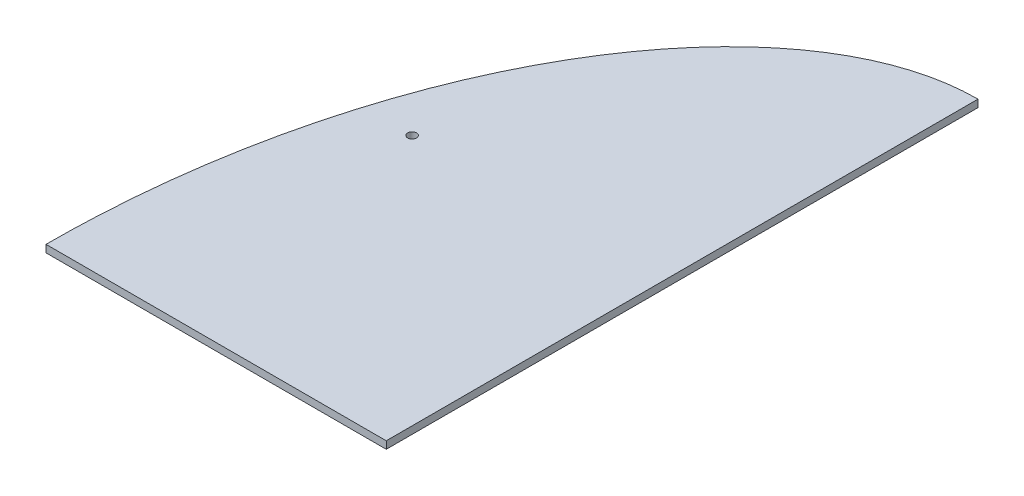
ISO-10303-21;
HEADER;
FILE_DESCRIPTION(('STEP AP214'),'2;1');
FILE_NAME('part.step','',(''),(''),'','','');
FILE_SCHEMA(('AUTOMOTIVE_DESIGN { 1 0 10303 214 1 1 1 1 }'));
ENDSEC;
DATA;
#1=APPLICATION_CONTEXT('core data for automotive mechanical design processes');
#2=APPLICATION_PROTOCOL_DEFINITION('international standard','automotive_design',2000,#1);
#3=PRODUCT_CONTEXT('',#1,'mechanical');
#4=PRODUCT('Part','Part','',(#3));
#5=PRODUCT_RELATED_PRODUCT_CATEGORY('part','',(#4));
#6=PRODUCT_DEFINITION_FORMATION('','',#4);
#7=PRODUCT_DEFINITION_CONTEXT('part definition',#1,'design');
#8=PRODUCT_DEFINITION('design','',#6,#7);
#9=PRODUCT_DEFINITION_SHAPE('','',#8);
#10=(LENGTH_UNIT() NAMED_UNIT(*) SI_UNIT(.MILLI.,.METRE.));
#11=(NAMED_UNIT(*) PLANE_ANGLE_UNIT() SI_UNIT($,.RADIAN.));
#12=(NAMED_UNIT(*) SI_UNIT($,.STERADIAN.) SOLID_ANGLE_UNIT());
#13=UNCERTAINTY_MEASURE_WITH_UNIT(LENGTH_MEASURE(1.E-05),#10,'distance_accuracy_value','');
#14=(GEOMETRIC_REPRESENTATION_CONTEXT(3) GLOBAL_UNCERTAINTY_ASSIGNED_CONTEXT((#13)) GLOBAL_UNIT_ASSIGNED_CONTEXT((#10,
#11,#12)) REPRESENTATION_CONTEXT('',''));
#15=CARTESIAN_POINT('',(0.,0.,0.));
#16=DIRECTION('',(0.,0.,1.));
#17=DIRECTION('',(1.,0.,0.));
#18=AXIS2_PLACEMENT_3D('',#15,#16,#17);
#19=CARTESIAN_POINT('',(0.,10.,0.));
#20=DIRECTION('',(0.,1.,0.));
#21=DIRECTION('',(0.,0.,-1.));
#22=AXIS2_PLACEMENT_3D('',#19,#20,#21);
#23=ELLIPSE('',#22,800.,460.);
#24=DIRECTION('',(0.,-1.,0.));
#25=VECTOR('',#24,1.);
#26=SURFACE_OF_LINEAR_EXTRUSION('',#23,#25);
#27=CARTESIAN_POINT('',(0.,0.,0.));
#28=DIRECTION('',(0.,1.,0.));
#29=DIRECTION('',(0.,0.,-1.));
#30=AXIS2_PLACEMENT_3D('',#27,#28,#29);
#31=ELLIPSE('',#30,800.,460.);
#32=CARTESIAN_POINT('',(0.,0.,-800.));
#33=VERTEX_POINT('',#32);
#34=CARTESIAN_POINT('',(-460.,0.,0.));
#35=VERTEX_POINT('',#34);
#36=EDGE_CURVE('E41',#33,#35,#31,.T.);
#37=ORIENTED_EDGE('',*,*,#36,.T.);
#38=DIRECTION('',(0.,1.,0.));
#39=VECTOR('',#38,1.);
#40=CARTESIAN_POINT('',(-460.,0.,0.));
#41=LINE('',#40,#39);
#42=CARTESIAN_POINT('',(-460.,10.,0.));
#43=VERTEX_POINT('',#42);
#44=EDGE_CURVE('E87',#35,#43,#41,.T.);
#45=ORIENTED_EDGE('',*,*,#44,.T.);
#46=CARTESIAN_POINT('',(0.,10.,-800.));
#47=VERTEX_POINT('',#46);
#48=EDGE_CURVE('E11',#47,#43,#23,.T.);
#49=ORIENTED_EDGE('',*,*,#48,.F.);
#50=DIRECTION('',(0.,1.,0.));
#51=VECTOR('',#50,1.);
#52=CARTESIAN_POINT('',(0.,0.,-800.));
#53=LINE('',#52,#51);
#54=EDGE_CURVE('E73',#33,#47,#53,.T.);
#55=ORIENTED_EDGE('',*,*,#54,.F.);
#56=EDGE_LOOP('',(#37,#45,#49,#55));
#57=FACE_BOUND('',#56,.T.);
#58=ADVANCED_FACE('F37',(#57),#26,.F.);
#59=CARTESIAN_POINT('',(0.,10.,0.));
#60=DIRECTION('',(0.,1.,0.));
#61=DIRECTION('',(0.,0.,1.));
#62=AXIS2_PLACEMENT_3D('',#59,#60,#61);
#63=PLANE('',#62);
#64=CARTESIAN_POINT('',(-340.,10.,-375.));
#65=DIRECTION('',(0.,1.,0.));
#66=DIRECTION('',(0.,0.,1.));
#67=AXIS2_PLACEMENT_3D('',#64,#65,#66);
#68=CIRCLE('',#67,6.00000000000001);
#69=CARTESIAN_POINT('',(-340.,10.,-369.));
#70=VERTEX_POINT('',#69);
#71=EDGE_CURVE('E78',#70,#70,#68,.T.);
#72=ORIENTED_EDGE('',*,*,#71,.F.);
#73=EDGE_LOOP('',(#72));
#74=FACE_BOUND('',#73,.T.);
#75=DIRECTION('',(-1.,0.,0.));
#76=VECTOR('',#75,1.);
#77=CARTESIAN_POINT('',(0.,10.,0.));
#78=LINE('',#77,#76);
#79=CARTESIAN_POINT('',(0.,10.,0.));
#80=VERTEX_POINT('',#79);
#81=EDGE_CURVE('E56',#80,#43,#78,.T.);
#82=ORIENTED_EDGE('',*,*,#81,.F.);
#83=DIRECTION('',(0.,0.,1.));
#84=VECTOR('',#83,1.);
#85=CARTESIAN_POINT('',(0.,10.,0.));
#86=LINE('',#85,#84);
#87=EDGE_CURVE('E85',#47,#80,#86,.T.);
#88=ORIENTED_EDGE('',*,*,#87,.F.);
#89=ORIENTED_EDGE('',*,*,#48,.T.);
#90=EDGE_LOOP('',(#82,#88,#89));
#91=FACE_BOUND('',#90,.T.);
#92=ADVANCED_FACE('F112',(#74,#91),#63,.T.);
#93=CARTESIAN_POINT('',(0.,0.,0.));
#94=DIRECTION('',(0.,1.,0.));
#95=DIRECTION('',(0.,0.,1.));
#96=AXIS2_PLACEMENT_3D('',#93,#94,#95);
#97=PLANE('',#96);
#98=CARTESIAN_POINT('',(-340.,0.,-375.));
#99=DIRECTION('',(0.,1.,0.));
#100=DIRECTION('',(0.,0.,1.));
#101=AXIS2_PLACEMENT_3D('',#98,#99,#100);
#102=CIRCLE('',#101,6.00000000000001);
#103=CARTESIAN_POINT('',(-340.,0.,-369.));
#104=VERTEX_POINT('',#103);
#105=EDGE_CURVE('E96',#104,#104,#102,.T.);
#106=ORIENTED_EDGE('',*,*,#105,.T.);
#107=EDGE_LOOP('',(#106));
#108=FACE_BOUND('',#107,.T.);
#109=DIRECTION('',(0.,0.,1.));
#110=VECTOR('',#109,1.);
#111=CARTESIAN_POINT('',(0.,0.,0.));
#112=LINE('',#111,#110);
#113=CARTESIAN_POINT('',(0.,0.,0.));
#114=VERTEX_POINT('',#113);
#115=EDGE_CURVE('E70',#33,#114,#112,.T.);
#116=ORIENTED_EDGE('',*,*,#115,.T.);
#117=DIRECTION('',(-1.,0.,0.));
#118=VECTOR('',#117,1.);
#119=CARTESIAN_POINT('',(-460.,0.,0.));
#120=LINE('',#119,#118);
#121=EDGE_CURVE('E51',#114,#35,#120,.T.);
#122=ORIENTED_EDGE('',*,*,#121,.T.);
#123=ORIENTED_EDGE('',*,*,#36,.F.);
#124=EDGE_LOOP('',(#116,#122,#123));
#125=FACE_BOUND('',#124,.T.);
#126=ADVANCED_FACE('F84',(#108,#125),#97,.F.);
#127=CARTESIAN_POINT('',(-460.,0.,0.));
#128=DIRECTION('',(0.,0.,-1.));
#129=DIRECTION('',(-1.,0.,0.));
#130=AXIS2_PLACEMENT_3D('',#127,#128,#129);
#131=PLANE('',#130);
#132=ORIENTED_EDGE('',*,*,#81,.T.);
#133=ORIENTED_EDGE('',*,*,#44,.F.);
#134=ORIENTED_EDGE('',*,*,#121,.F.);
#135=DIRECTION('',(0.,1.,0.));
#136=VECTOR('',#135,1.);
#137=CARTESIAN_POINT('',(0.,0.,0.));
#138=LINE('',#137,#136);
#139=EDGE_CURVE('E75',#114,#80,#138,.T.);
#140=ORIENTED_EDGE('',*,*,#139,.T.);
#141=EDGE_LOOP('',(#132,#133,#134,#140));
#142=FACE_BOUND('',#141,.T.);
#143=ADVANCED_FACE('F108',(#142),#131,.F.);
#144=CARTESIAN_POINT('',(0.,0.,0.));
#145=DIRECTION('',(-1.,0.,0.));
#146=DIRECTION('',(0.,0.,1.));
#147=AXIS2_PLACEMENT_3D('',#144,#145,#146);
#148=PLANE('',#147);
#149=ORIENTED_EDGE('',*,*,#87,.T.);
#150=ORIENTED_EDGE('',*,*,#139,.F.);
#151=ORIENTED_EDGE('',*,*,#115,.F.);
#152=ORIENTED_EDGE('',*,*,#54,.T.);
#153=EDGE_LOOP('',(#149,#150,#151,#152));
#154=FACE_BOUND('',#153,.T.);
#155=ADVANCED_FACE('F72',(#154),#148,.F.);
#156=CARTESIAN_POINT('',(-340.,15.0000000000001,-375.));
#157=DIRECTION('',(0.,1.,0.));
#158=DIRECTION('',(0.,0.,1.));
#159=AXIS2_PLACEMENT_3D('',#156,#157,#158);
#160=CYLINDRICAL_SURFACE('',#159,6.00000000000001);
#161=ORIENTED_EDGE('',*,*,#71,.T.);
#162=EDGE_LOOP('',(#161));
#163=FACE_BOUND('',#162,.T.);
#164=ORIENTED_EDGE('',*,*,#105,.F.);
#165=EDGE_LOOP('',(#164));
#166=FACE_BOUND('',#165,.T.);
#167=ADVANCED_FACE('F101',(#163,#166),#160,.F.);
#168=CLOSED_SHELL('',(#58,#92,#126,#143,#155,#167));
#169=MANIFOLD_SOLID_BREP('B2',#168);
#170=ADVANCED_BREP_SHAPE_REPRESENTATION('',(#18,#169),#14);
#171=SHAPE_DEFINITION_REPRESENTATION(#9,#170);
ENDSEC;
END-ISO-10303-21;
